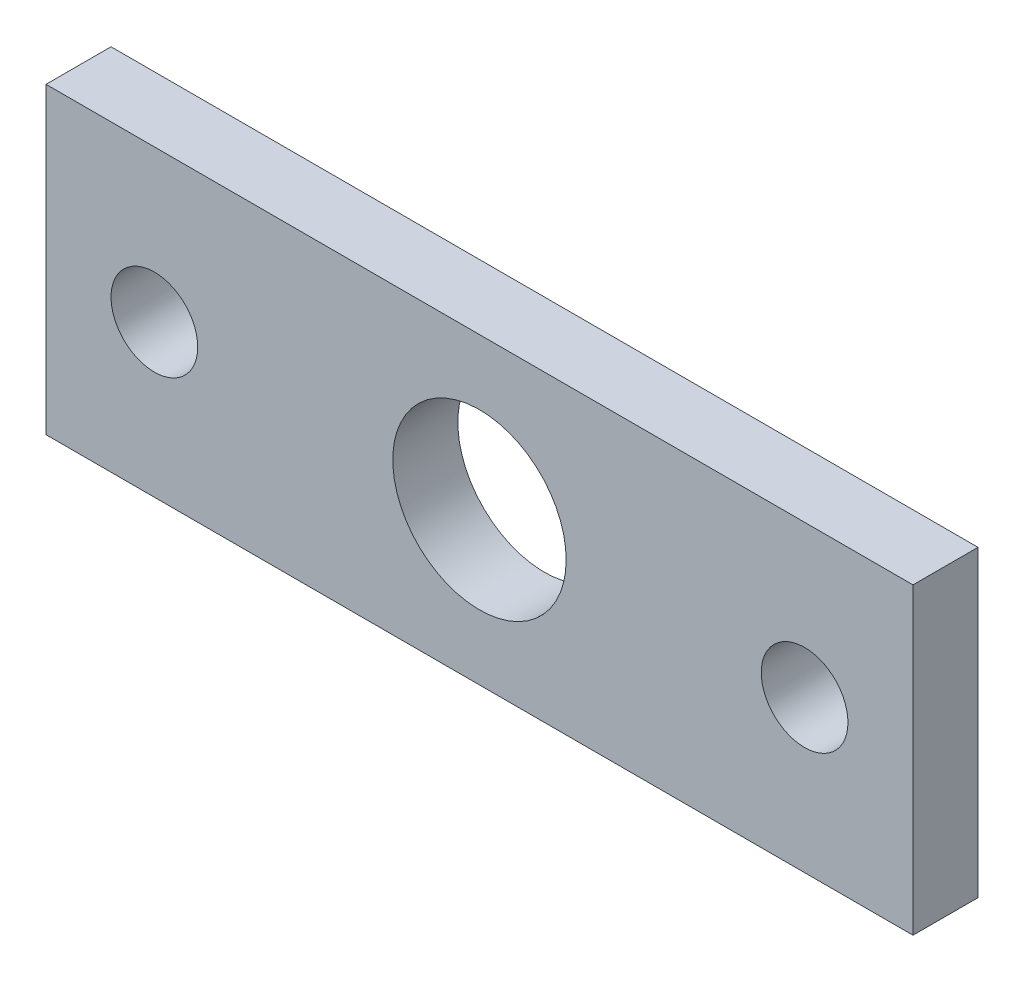
ISO-10303-21;
HEADER;
FILE_DESCRIPTION(('STEP AP214'),'2;1');
FILE_NAME('part.step','',(''),(''),'','','');
FILE_SCHEMA(('AUTOMOTIVE_DESIGN { 1 0 10303 214 1 1 1 1 }'));
ENDSEC;
DATA;
#1=APPLICATION_CONTEXT('core data for automotive mechanical design processes');
#2=APPLICATION_PROTOCOL_DEFINITION('international standard','automotive_design',2000,#1);
#3=PRODUCT_CONTEXT('',#1,'mechanical');
#4=PRODUCT('Part','Part','',(#3));
#5=PRODUCT_RELATED_PRODUCT_CATEGORY('part','',(#4));
#6=PRODUCT_DEFINITION_FORMATION('','',#4);
#7=PRODUCT_DEFINITION_CONTEXT('part definition',#1,'design');
#8=PRODUCT_DEFINITION('design','',#6,#7);
#9=PRODUCT_DEFINITION_SHAPE('','',#8);
#10=(LENGTH_UNIT() NAMED_UNIT(*) SI_UNIT(.MILLI.,.METRE.));
#11=(NAMED_UNIT(*) PLANE_ANGLE_UNIT() SI_UNIT($,.RADIAN.));
#12=(NAMED_UNIT(*) SI_UNIT($,.STERADIAN.) SOLID_ANGLE_UNIT());
#13=UNCERTAINTY_MEASURE_WITH_UNIT(LENGTH_MEASURE(1.E-05),#10,'distance_accuracy_value','');
#14=(GEOMETRIC_REPRESENTATION_CONTEXT(3) GLOBAL_UNCERTAINTY_ASSIGNED_CONTEXT((#13)) GLOBAL_UNIT_ASSIGNED_CONTEXT((#10,
#11,#12)) REPRESENTATION_CONTEXT('',''));
#15=CARTESIAN_POINT('',(0.,0.,0.));
#16=DIRECTION('',(0.,0.,1.));
#17=DIRECTION('',(1.,0.,0.));
#18=AXIS2_PLACEMENT_3D('',#15,#16,#17);
#19=CARTESIAN_POINT('',(0.,0.,3.));
#20=DIRECTION('',(0.,0.,-1.));
#21=DIRECTION('',(-1.,0.,0.));
#22=AXIS2_PLACEMENT_3D('',#19,#20,#21);
#23=PLANE('',#22);
#24=DIRECTION('',(0.,1.,0.));
#25=VECTOR('',#24,1.);
#26=CARTESIAN_POINT('',(-39.9999999999998,-17.9999999999999,3.));
#27=LINE('',#26,#25);
#28=CARTESIAN_POINT('',(-39.9999999999998,-31.9999999999999,3.));
#29=VERTEX_POINT('',#28);
#30=CARTESIAN_POINT('',(-39.9999999999998,-17.9999999999999,3.));
#31=VERTEX_POINT('',#30);
#32=EDGE_CURVE('E87',#29,#31,#27,.T.);
#33=ORIENTED_EDGE('',*,*,#32,.T.);
#34=DIRECTION('',(-1.,0.,0.));
#35=VECTOR('',#34,1.);
#36=CARTESIAN_POINT('',(-39.9999999999998,-17.9999999999999,3.));
#37=LINE('',#36,#35);
#38=CARTESIAN_POINT('',(-79.9999999999998,-17.9999999999999,3.));
#39=VERTEX_POINT('',#38);
#40=EDGE_CURVE('E82',#31,#39,#37,.T.);
#41=ORIENTED_EDGE('',*,*,#40,.T.);
#42=DIRECTION('',(0.,-1.,0.));
#43=VECTOR('',#42,1.);
#44=CARTESIAN_POINT('',(-79.9999999999998,-17.9999999999999,3.));
#45=LINE('',#44,#43);
#46=CARTESIAN_POINT('',(-79.9999999999998,-31.9999999999999,3.));
#47=VERTEX_POINT('',#46);
#48=EDGE_CURVE('E85',#39,#47,#45,.T.);
#49=ORIENTED_EDGE('',*,*,#48,.T.);
#50=DIRECTION('',(1.,0.,0.));
#51=VECTOR('',#50,1.);
#52=CARTESIAN_POINT('',(-39.9999999999998,-31.9999999999999,3.));
#53=LINE('',#52,#51);
#54=EDGE_CURVE('E52',#47,#29,#53,.T.);
#55=ORIENTED_EDGE('',*,*,#54,.T.);
#56=EDGE_LOOP('',(#33,#41,#49,#55));
#57=FACE_BOUND('',#56,.T.);
#58=CARTESIAN_POINT('',(-44.9999999999998,-24.9999999999999,3.));
#59=DIRECTION('',(0.,0.,1.));
#60=DIRECTION('',(1.,0.,0.));
#61=AXIS2_PLACEMENT_3D('',#58,#59,#60);
#62=CIRCLE('',#61,2.);
#63=CARTESIAN_POINT('',(-42.9999999999998,-24.9999999999999,3.));
#64=VERTEX_POINT('',#63);
#65=EDGE_CURVE('E102',#64,#64,#62,.T.);
#66=ORIENTED_EDGE('',*,*,#65,.F.);
#67=EDGE_LOOP('',(#66));
#68=FACE_BOUND('',#67,.T.);
#69=CARTESIAN_POINT('',(-74.9999999999998,-24.9999999999999,3.));
#70=DIRECTION('',(0.,0.,1.));
#71=DIRECTION('',(1.,0.,0.));
#72=AXIS2_PLACEMENT_3D('',#69,#70,#71);
#73=CIRCLE('',#72,2.);
#74=CARTESIAN_POINT('',(-72.9999999999998,-24.9999999999999,3.));
#75=VERTEX_POINT('',#74);
#76=EDGE_CURVE('E117',#75,#75,#73,.T.);
#77=ORIENTED_EDGE('',*,*,#76,.F.);
#78=EDGE_LOOP('',(#77));
#79=FACE_BOUND('',#78,.T.);
#80=CARTESIAN_POINT('',(-59.9999999999998,-24.9999999999999,3.));
#81=DIRECTION('',(0.,0.,1.));
#82=DIRECTION('',(1.,0.,0.));
#83=AXIS2_PLACEMENT_3D('',#80,#81,#82);
#84=CIRCLE('',#83,4.00000000000001);
#85=CARTESIAN_POINT('',(-55.9999999999998,-24.9999999999999,3.));
#86=VERTEX_POINT('',#85);
#87=EDGE_CURVE('E123',#86,#86,#84,.T.);
#88=ORIENTED_EDGE('',*,*,#87,.F.);
#89=EDGE_LOOP('',(#88));
#90=FACE_BOUND('',#89,.T.);
#91=ADVANCED_FACE('F35',(#57,#68,#79,#90),#23,.F.);
#92=CARTESIAN_POINT('',(0.,0.,0.));
#93=DIRECTION('',(0.,0.,-1.));
#94=DIRECTION('',(-1.,0.,0.));
#95=AXIS2_PLACEMENT_3D('',#92,#93,#94);
#96=PLANE('',#95);
#97=CARTESIAN_POINT('',(-74.9999999999998,-24.9999999999999,0.));
#98=DIRECTION('',(0.,0.,1.));
#99=DIRECTION('',(1.,0.,0.));
#100=AXIS2_PLACEMENT_3D('',#97,#98,#99);
#101=CIRCLE('',#100,2.);
#102=CARTESIAN_POINT('',(-72.9999999999998,-24.9999999999999,0.));
#103=VERTEX_POINT('',#102);
#104=EDGE_CURVE('E120',#103,#103,#101,.T.);
#105=ORIENTED_EDGE('',*,*,#104,.T.);
#106=EDGE_LOOP('',(#105));
#107=FACE_BOUND('',#106,.T.);
#108=DIRECTION('',(0.,1.,0.));
#109=VECTOR('',#108,1.);
#110=CARTESIAN_POINT('',(-39.9999999999998,-17.9999999999999,0.));
#111=LINE('',#110,#109);
#112=CARTESIAN_POINT('',(-39.9999999999998,-31.9999999999999,0.));
#113=VERTEX_POINT('',#112);
#114=CARTESIAN_POINT('',(-39.9999999999998,-17.9999999999999,0.));
#115=VERTEX_POINT('',#114);
#116=EDGE_CURVE('E99',#113,#115,#111,.T.);
#117=ORIENTED_EDGE('',*,*,#116,.F.);
#118=DIRECTION('',(1.,0.,0.));
#119=VECTOR('',#118,1.);
#120=CARTESIAN_POINT('',(-39.9999999999998,-31.9999999999999,0.));
#121=LINE('',#120,#119);
#122=CARTESIAN_POINT('',(-79.9999999999998,-31.9999999999999,0.));
#123=VERTEX_POINT('',#122);
#124=EDGE_CURVE('E75',#123,#113,#121,.T.);
#125=ORIENTED_EDGE('',*,*,#124,.F.);
#126=DIRECTION('',(0.,-1.,0.));
#127=VECTOR('',#126,1.);
#128=CARTESIAN_POINT('',(-79.9999999999998,-17.9999999999999,0.));
#129=LINE('',#128,#127);
#130=CARTESIAN_POINT('',(-79.9999999999998,-17.9999999999999,0.));
#131=VERTEX_POINT('',#130);
#132=EDGE_CURVE('E69',#131,#123,#129,.T.);
#133=ORIENTED_EDGE('',*,*,#132,.F.);
#134=DIRECTION('',(-1.,0.,0.));
#135=VECTOR('',#134,1.);
#136=CARTESIAN_POINT('',(-39.9999999999998,-17.9999999999999,0.));
#137=LINE('',#136,#135);
#138=EDGE_CURVE('E91',#115,#131,#137,.T.);
#139=ORIENTED_EDGE('',*,*,#138,.F.);
#140=EDGE_LOOP('',(#117,#125,#133,#139));
#141=FACE_BOUND('',#140,.T.);
#142=CARTESIAN_POINT('',(-44.9999999999998,-24.9999999999999,0.));
#143=DIRECTION('',(0.,0.,1.));
#144=DIRECTION('',(1.,0.,0.));
#145=AXIS2_PLACEMENT_3D('',#142,#143,#144);
#146=CIRCLE('',#145,2.);
#147=CARTESIAN_POINT('',(-42.9999999999998,-24.9999999999999,0.));
#148=VERTEX_POINT('',#147);
#149=EDGE_CURVE('E114',#148,#148,#146,.T.);
#150=ORIENTED_EDGE('',*,*,#149,.T.);
#151=EDGE_LOOP('',(#150));
#152=FACE_BOUND('',#151,.T.);
#153=CARTESIAN_POINT('',(-59.9999999999998,-24.9999999999999,0.));
#154=DIRECTION('',(0.,0.,1.));
#155=DIRECTION('',(1.,0.,0.));
#156=AXIS2_PLACEMENT_3D('',#153,#154,#155);
#157=CIRCLE('',#156,4.00000000000001);
#158=CARTESIAN_POINT('',(-55.9999999999998,-24.9999999999999,0.));
#159=VERTEX_POINT('',#158);
#160=EDGE_CURVE('E126',#159,#159,#157,.T.);
#161=ORIENTED_EDGE('',*,*,#160,.T.);
#162=EDGE_LOOP('',(#161));
#163=FACE_BOUND('',#162,.T.);
#164=ADVANCED_FACE('F110',(#107,#141,#152,#163),#96,.T.);
#165=CARTESIAN_POINT('',(-39.9999999999998,-17.9999999999999,3.));
#166=DIRECTION('',(-1.,0.,0.));
#167=DIRECTION('',(0.,0.,1.));
#168=AXIS2_PLACEMENT_3D('',#165,#166,#167);
#169=PLANE('',#168);
#170=ORIENTED_EDGE('',*,*,#116,.T.);
#171=DIRECTION('',(0.,0.,-1.));
#172=VECTOR('',#171,1.);
#173=CARTESIAN_POINT('',(-39.9999999999998,-17.9999999999999,3.));
#174=LINE('',#173,#172);
#175=EDGE_CURVE('E11',#31,#115,#174,.T.);
#176=ORIENTED_EDGE('',*,*,#175,.F.);
#177=ORIENTED_EDGE('',*,*,#32,.F.);
#178=DIRECTION('',(0.,0.,-1.));
#179=VECTOR('',#178,1.);
#180=CARTESIAN_POINT('',(-39.9999999999998,-31.9999999999999,3.));
#181=LINE('',#180,#179);
#182=EDGE_CURVE('E95',#29,#113,#181,.T.);
#183=ORIENTED_EDGE('',*,*,#182,.T.);
#184=EDGE_LOOP('',(#170,#176,#177,#183));
#185=FACE_BOUND('',#184,.T.);
#186=ADVANCED_FACE('F37',(#185),#169,.F.);
#187=CARTESIAN_POINT('',(-39.9999999999998,-17.9999999999999,3.));
#188=DIRECTION('',(0.,-1.,0.));
#189=DIRECTION('',(1.,0.,0.));
#190=AXIS2_PLACEMENT_3D('',#187,#188,#189);
#191=PLANE('',#190);
#192=ORIENTED_EDGE('',*,*,#138,.T.);
#193=DIRECTION('',(0.,0.,-1.));
#194=VECTOR('',#193,1.);
#195=CARTESIAN_POINT('',(-79.9999999999998,-17.9999999999999,3.));
#196=LINE('',#195,#194);
#197=EDGE_CURVE('E44',#39,#131,#196,.T.);
#198=ORIENTED_EDGE('',*,*,#197,.F.);
#199=ORIENTED_EDGE('',*,*,#40,.F.);
#200=ORIENTED_EDGE('',*,*,#175,.T.);
#201=EDGE_LOOP('',(#192,#198,#199,#200));
#202=FACE_BOUND('',#201,.T.);
#203=ADVANCED_FACE('F90',(#202),#191,.F.);
#204=CARTESIAN_POINT('',(-79.9999999999998,-17.9999999999999,3.));
#205=DIRECTION('',(1.,0.,0.));
#206=DIRECTION('',(0.,0.,-1.));
#207=AXIS2_PLACEMENT_3D('',#204,#205,#206);
#208=PLANE('',#207);
#209=ORIENTED_EDGE('',*,*,#132,.T.);
#210=DIRECTION('',(0.,0.,-1.));
#211=VECTOR('',#210,1.);
#212=CARTESIAN_POINT('',(-79.9999999999998,-31.9999999999999,3.));
#213=LINE('',#212,#211);
#214=EDGE_CURVE('E92',#47,#123,#213,.T.);
#215=ORIENTED_EDGE('',*,*,#214,.F.);
#216=ORIENTED_EDGE('',*,*,#48,.F.);
#217=ORIENTED_EDGE('',*,*,#197,.T.);
#218=EDGE_LOOP('',(#209,#215,#216,#217));
#219=FACE_BOUND('',#218,.T.);
#220=ADVANCED_FACE('F93',(#219),#208,.F.);
#221=CARTESIAN_POINT('',(-39.9999999999998,-31.9999999999999,3.));
#222=DIRECTION('',(0.,1.,0.));
#223=DIRECTION('',(-1.,0.,0.));
#224=AXIS2_PLACEMENT_3D('',#221,#222,#223);
#225=PLANE('',#224);
#226=ORIENTED_EDGE('',*,*,#124,.T.);
#227=ORIENTED_EDGE('',*,*,#182,.F.);
#228=ORIENTED_EDGE('',*,*,#54,.F.);
#229=ORIENTED_EDGE('',*,*,#214,.T.);
#230=EDGE_LOOP('',(#226,#227,#228,#229));
#231=FACE_BOUND('',#230,.T.);
#232=ADVANCED_FACE('F107',(#231),#225,.F.);
#233=CARTESIAN_POINT('',(-44.9999999999998,-24.9999999999999,3.));
#234=DIRECTION('',(0.,0.,-1.));
#235=DIRECTION('',(-1.,0.,0.));
#236=AXIS2_PLACEMENT_3D('',#233,#234,#235);
#237=CYLINDRICAL_SURFACE('',#236,2.);
#238=ORIENTED_EDGE('',*,*,#65,.T.);
#239=EDGE_LOOP('',(#238));
#240=FACE_BOUND('',#239,.T.);
#241=ORIENTED_EDGE('',*,*,#149,.F.);
#242=EDGE_LOOP('',(#241));
#243=FACE_BOUND('',#242,.T.);
#244=ADVANCED_FACE('F143',(#240,#243),#237,.F.);
#245=CARTESIAN_POINT('',(-74.9999999999998,-24.9999999999999,3.));
#246=DIRECTION('',(0.,0.,-1.));
#247=DIRECTION('',(-1.,0.,0.));
#248=AXIS2_PLACEMENT_3D('',#245,#246,#247);
#249=CYLINDRICAL_SURFACE('',#248,2.);
#250=ORIENTED_EDGE('',*,*,#76,.T.);
#251=EDGE_LOOP('',(#250));
#252=FACE_BOUND('',#251,.T.);
#253=ORIENTED_EDGE('',*,*,#104,.F.);
#254=EDGE_LOOP('',(#253));
#255=FACE_BOUND('',#254,.T.);
#256=ADVANCED_FACE('F189',(#252,#255),#249,.F.);
#257=CARTESIAN_POINT('',(-59.9999999999998,-24.9999999999999,3.));
#258=DIRECTION('',(0.,0.,-1.));
#259=DIRECTION('',(-1.,0.,0.));
#260=AXIS2_PLACEMENT_3D('',#257,#258,#259);
#261=CYLINDRICAL_SURFACE('',#260,4.00000000000001);
#262=ORIENTED_EDGE('',*,*,#87,.T.);
#263=EDGE_LOOP('',(#262));
#264=FACE_BOUND('',#263,.T.);
#265=ORIENTED_EDGE('',*,*,#160,.F.);
#266=EDGE_LOOP('',(#265));
#267=FACE_BOUND('',#266,.T.);
#268=ADVANCED_FACE('F132',(#264,#267),#261,.F.);
#269=CLOSED_SHELL('',(#91,#164,#186,#203,#220,#232,#244,#256,#268));
#270=MANIFOLD_SOLID_BREP('B2',#269);
#271=ADVANCED_BREP_SHAPE_REPRESENTATION('',(#18,#270),#14);
#272=SHAPE_DEFINITION_REPRESENTATION(#9,#271);
ENDSEC;
END-ISO-10303-21;
